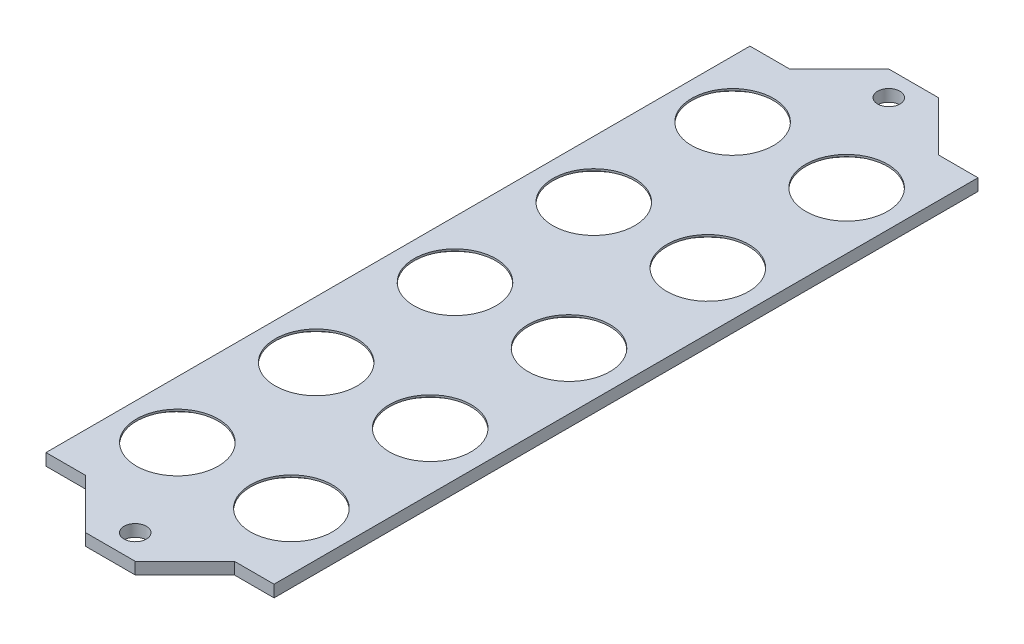
ISO-10303-21;
HEADER;
FILE_DESCRIPTION(('STEP AP214'),'2;1');
FILE_NAME('part.step','',(''),(''),'','','');
FILE_SCHEMA(('AUTOMOTIVE_DESIGN { 1 0 10303 214 1 1 1 1 }'));
ENDSEC;
DATA;
#1=APPLICATION_CONTEXT('core data for automotive mechanical design processes');
#2=APPLICATION_PROTOCOL_DEFINITION('international standard','automotive_design',2000,#1);
#3=PRODUCT_CONTEXT('',#1,'mechanical');
#4=PRODUCT('Part','Part','',(#3));
#5=PRODUCT_RELATED_PRODUCT_CATEGORY('part','',(#4));
#6=PRODUCT_DEFINITION_FORMATION('','',#4);
#7=PRODUCT_DEFINITION_CONTEXT('part definition',#1,'design');
#8=PRODUCT_DEFINITION('design','',#6,#7);
#9=PRODUCT_DEFINITION_SHAPE('','',#8);
#10=(LENGTH_UNIT() NAMED_UNIT(*) SI_UNIT(.MILLI.,.METRE.));
#11=(NAMED_UNIT(*) PLANE_ANGLE_UNIT() SI_UNIT($,.RADIAN.));
#12=(NAMED_UNIT(*) SI_UNIT($,.STERADIAN.) SOLID_ANGLE_UNIT());
#13=UNCERTAINTY_MEASURE_WITH_UNIT(LENGTH_MEASURE(1.E-05),#10,'distance_accuracy_value','');
#14=(GEOMETRIC_REPRESENTATION_CONTEXT(3) GLOBAL_UNCERTAINTY_ASSIGNED_CONTEXT((#13)) GLOBAL_UNIT_ASSIGNED_CONTEXT((#10,
#11,#12)) REPRESENTATION_CONTEXT('',''));
#15=CARTESIAN_POINT('',(0.,0.,0.));
#16=DIRECTION('',(0.,0.,1.));
#17=DIRECTION('',(1.,0.,0.));
#18=AXIS2_PLACEMENT_3D('',#15,#16,#17);
#19=CARTESIAN_POINT('',(0.,0.4,0.));
#20=DIRECTION('',(0.,1.,0.));
#21=DIRECTION('',(0.,0.,1.));
#22=AXIS2_PLACEMENT_3D('',#19,#20,#21);
#23=PLANE('',#22);
#24=CARTESIAN_POINT('',(11.5,0.4,132.));
#25=DIRECTION('',(0.,1.,0.));
#26=DIRECTION('',(0.,0.,1.));
#27=AXIS2_PLACEMENT_3D('',#24,#25,#26);
#28=CIRCLE('',#27,2.25);
#29=CARTESIAN_POINT('',(11.5,0.4,134.25));
#30=VERTEX_POINT('',#29);
#31=EDGE_CURVE('E752',#30,#30,#28,.F.);
#32=ORIENTED_EDGE('',*,*,#31,.T.);
#33=EDGE_LOOP('',(#32));
#34=FACE_BOUND('',#33,.T.);
#35=DIRECTION('',(0.70710678118656,0.,0.707106781186535));
#36=VECTOR('',#35,1.);
#37=CARTESIAN_POINT('',(20.7499999999997,0.4,-20.7500000000004));
#38=LINE('',#37,#36);
#39=CARTESIAN_POINT('',(16.5,0.4,-25.));
#40=VERTEX_POINT('',#39);
#41=CARTESIAN_POINT('',(26.5000000000003,0.4,-15.));
#42=VERTEX_POINT('',#41);
#43=EDGE_CURVE('E533',#40,#42,#38,.T.);
#44=ORIENTED_EDGE('',*,*,#43,.F.);
#45=DIRECTION('',(1.,0.,0.));
#46=VECTOR('',#45,1.);
#47=CARTESIAN_POINT('',(4.68375338513744E-13,0.4,-25.0000000000003));
#48=LINE('',#47,#46);
#49=CARTESIAN_POINT('',(6.5,0.4,-25.0000000000002));
#50=VERTEX_POINT('',#49);
#51=EDGE_CURVE('E600',#50,#40,#48,.T.);
#52=ORIENTED_EDGE('',*,*,#51,.F.);
#53=DIRECTION('',(-0.707106781186544,0.,0.707106781186551));
#54=VECTOR('',#53,1.);
#55=CARTESIAN_POINT('',(-9.25000000000006,0.4,-9.24999999999996));
#56=LINE('',#55,#54);
#57=CARTESIAN_POINT('',(-3.5,0.4,-15.));
#58=VERTEX_POINT('',#57);
#59=EDGE_CURVE('E605',#50,#58,#56,.T.);
#60=ORIENTED_EDGE('',*,*,#59,.T.);
#61=DIRECTION('',(1.,0.,0.));
#62=VECTOR('',#61,1.);
#63=CARTESIAN_POINT('',(0.,0.4,-15.));
#64=LINE('',#63,#62);
#65=CARTESIAN_POINT('',(-11.5,0.4,-15.));
#66=VERTEX_POINT('',#65);
#67=EDGE_CURVE('E608',#66,#58,#64,.T.);
#68=ORIENTED_EDGE('',*,*,#67,.F.);
#69=DIRECTION('',(0.,0.,1.));
#70=VECTOR('',#69,1.);
#71=CARTESIAN_POINT('',(-11.5,0.4,0.));
#72=LINE('',#71,#70);
#73=CARTESIAN_POINT('',(-11.5,0.4,127.));
#74=VERTEX_POINT('',#73);
#75=EDGE_CURVE('E612',#66,#74,#72,.T.);
#76=ORIENTED_EDGE('',*,*,#75,.T.);
#77=DIRECTION('',(1.,0.,0.));
#78=VECTOR('',#77,1.);
#79=CARTESIAN_POINT('',(0.,0.4,127.));
#80=LINE('',#79,#78);
#81=CARTESIAN_POINT('',(-3.50000000000012,0.4,127.));
#82=VERTEX_POINT('',#81);
#83=EDGE_CURVE('E616',#74,#82,#80,.T.);
#84=ORIENTED_EDGE('',*,*,#83,.T.);
#85=DIRECTION('',(-0.707106781186548,0.,-0.707106781186547));
#86=VECTOR('',#85,1.);
#87=CARTESIAN_POINT('',(-65.2500000000001,0.4,65.2500000000002));
#88=LINE('',#87,#86);
#89=CARTESIAN_POINT('',(6.49999999999995,0.4,137.));
#90=VERTEX_POINT('',#89);
#91=EDGE_CURVE('E619',#90,#82,#88,.T.);
#92=ORIENTED_EDGE('',*,*,#91,.F.);
#93=DIRECTION('',(1.,0.,0.));
#94=VECTOR('',#93,1.);
#95=CARTESIAN_POINT('',(-3.80251385934116E-13,0.4,137.));
#96=LINE('',#95,#94);
#97=CARTESIAN_POINT('',(16.4999999999999,0.4,137.));
#98=VERTEX_POINT('',#97);
#99=EDGE_CURVE('E624',#90,#98,#96,.T.);
#100=ORIENTED_EDGE('',*,*,#99,.T.);
#101=DIRECTION('',(0.707106781186546,0.,-0.707106781186549));
#102=VECTOR('',#101,1.);
#103=CARTESIAN_POINT('',(76.75,0.4,76.7499999999997));
#104=LINE('',#103,#102);
#105=CARTESIAN_POINT('',(26.4999999999999,0.4,127.));
#106=VERTEX_POINT('',#105);
#107=EDGE_CURVE('E627',#98,#106,#104,.T.);
#108=ORIENTED_EDGE('',*,*,#107,.T.);
#109=CARTESIAN_POINT('',(34.5,0.4,127.));
#110=VERTEX_POINT('',#109);
#111=EDGE_CURVE('E620',#106,#110,#80,.T.);
#112=ORIENTED_EDGE('',*,*,#111,.T.);
#113=DIRECTION('',(0.,0.,1.));
#114=VECTOR('',#113,1.);
#115=CARTESIAN_POINT('',(34.5,0.4,0.));
#116=LINE('',#115,#114);
#117=CARTESIAN_POINT('',(34.5,0.4,-15.));
#118=VERTEX_POINT('',#117);
#119=EDGE_CURVE('E630',#118,#110,#116,.T.);
#120=ORIENTED_EDGE('',*,*,#119,.F.);
#121=EDGE_CURVE('E613',#42,#118,#64,.T.);
#122=ORIENTED_EDGE('',*,*,#121,.F.);
#123=EDGE_LOOP('',(#44,#52,#60,#68,#76,#84,#92,#100,#108,#112,#120,#122));
#124=FACE_BOUND('',#123,.T.);
#125=CARTESIAN_POINT('',(0.,0.4,0.));
#126=DIRECTION('',(0.,1.,0.));
#127=DIRECTION('',(0.,0.,1.));
#128=AXIS2_PLACEMENT_3D('',#125,#126,#127);
#129=CIRCLE('',#128,8.25);
#130=CARTESIAN_POINT('',(0.,0.4,8.25));
#131=VERTEX_POINT('',#130);
#132=EDGE_CURVE('E633',#131,#131,#129,.T.);
#133=ORIENTED_EDGE('',*,*,#132,.F.);
#134=EDGE_LOOP('',(#133));
#135=FACE_BOUND('',#134,.T.);
#136=CARTESIAN_POINT('',(23.,0.4,0.));
#137=DIRECTION('',(0.,1.,0.));
#138=DIRECTION('',(0.,0.,1.));
#139=AXIS2_PLACEMENT_3D('',#136,#137,#138);
#140=CIRCLE('',#139,8.25000000000001);
#141=CARTESIAN_POINT('',(23.,0.4,8.25000000000001));
#142=VERTEX_POINT('',#141);
#143=EDGE_CURVE('E637',#142,#142,#140,.T.);
#144=ORIENTED_EDGE('',*,*,#143,.F.);
#145=EDGE_LOOP('',(#144));
#146=FACE_BOUND('',#145,.T.);
#147=CARTESIAN_POINT('',(23.0000000000003,0.4,28.));
#148=DIRECTION('',(0.,1.,0.));
#149=DIRECTION('',(0.,0.,1.));
#150=AXIS2_PLACEMENT_3D('',#147,#148,#149);
#151=CIRCLE('',#150,8.25000000000001);
#152=CARTESIAN_POINT('',(23.0000000000003,0.4,36.25));
#153=VERTEX_POINT('',#152);
#154=EDGE_CURVE('E641',#153,#153,#151,.T.);
#155=ORIENTED_EDGE('',*,*,#154,.F.);
#156=EDGE_LOOP('',(#155));
#157=FACE_BOUND('',#156,.T.);
#158=CARTESIAN_POINT('',(2.91569926944017E-13,0.4,28.));
#159=DIRECTION('',(0.,1.,0.));
#160=DIRECTION('',(0.,0.,1.));
#161=AXIS2_PLACEMENT_3D('',#158,#159,#160);
#162=CIRCLE('',#161,8.25);
#163=CARTESIAN_POINT('',(2.91569926944017E-13,0.4,36.25));
#164=VERTEX_POINT('',#163);
#165=EDGE_CURVE('E645',#164,#164,#162,.T.);
#166=ORIENTED_EDGE('',*,*,#165,.F.);
#167=EDGE_LOOP('',(#166));
#168=FACE_BOUND('',#167,.T.);
#169=CARTESIAN_POINT('',(5.83139853888034E-13,0.4,56.));
#170=DIRECTION('',(0.,1.,0.));
#171=DIRECTION('',(0.,0.,1.));
#172=AXIS2_PLACEMENT_3D('',#169,#170,#171);
#173=CIRCLE('',#172,8.25);
#174=CARTESIAN_POINT('',(5.83139853888034E-13,0.4,64.25));
#175=VERTEX_POINT('',#174);
#176=EDGE_CURVE('E649',#175,#175,#173,.T.);
#177=ORIENTED_EDGE('',*,*,#176,.F.);
#178=EDGE_LOOP('',(#177));
#179=FACE_BOUND('',#178,.T.);
#180=CARTESIAN_POINT('',(23.0000000000006,0.4,56.));
#181=DIRECTION('',(0.,1.,0.));
#182=DIRECTION('',(0.,0.,1.));
#183=AXIS2_PLACEMENT_3D('',#180,#181,#182);
#184=CIRCLE('',#183,8.25000000000001);
#185=CARTESIAN_POINT('',(23.0000000000006,0.4,64.25));
#186=VERTEX_POINT('',#185);
#187=EDGE_CURVE('E653',#186,#186,#184,.T.);
#188=ORIENTED_EDGE('',*,*,#187,.F.);
#189=EDGE_LOOP('',(#188));
#190=FACE_BOUND('',#189,.T.);
#191=CARTESIAN_POINT('',(8.74709780832051E-13,0.4,84.));
#192=DIRECTION('',(0.,1.,0.));
#193=DIRECTION('',(0.,0.,1.));
#194=AXIS2_PLACEMENT_3D('',#191,#192,#193);
#195=CIRCLE('',#194,8.25);
#196=CARTESIAN_POINT('',(8.74709780832051E-13,0.4,92.25));
#197=VERTEX_POINT('',#196);
#198=EDGE_CURVE('E657',#197,#197,#195,.T.);
#199=ORIENTED_EDGE('',*,*,#198,.F.);
#200=EDGE_LOOP('',(#199));
#201=FACE_BOUND('',#200,.T.);
#202=CARTESIAN_POINT('',(23.0000000000009,0.4,84.));
#203=DIRECTION('',(0.,1.,0.));
#204=DIRECTION('',(0.,0.,1.));
#205=AXIS2_PLACEMENT_3D('',#202,#203,#204);
#206=CIRCLE('',#205,8.25000000000001);
#207=CARTESIAN_POINT('',(23.0000000000009,0.4,92.25));
#208=VERTEX_POINT('',#207);
#209=EDGE_CURVE('E661',#208,#208,#206,.T.);
#210=ORIENTED_EDGE('',*,*,#209,.F.);
#211=EDGE_LOOP('',(#210));
#212=FACE_BOUND('',#211,.T.);
#213=CARTESIAN_POINT('',(1.16627970777607E-12,0.4,112.));
#214=DIRECTION('',(0.,1.,0.));
#215=DIRECTION('',(0.,0.,1.));
#216=AXIS2_PLACEMENT_3D('',#213,#214,#215);
#217=CIRCLE('',#216,8.25);
#218=CARTESIAN_POINT('',(1.16627970777607E-12,0.4,120.25));
#219=VERTEX_POINT('',#218);
#220=EDGE_CURVE('E665',#219,#219,#217,.T.);
#221=ORIENTED_EDGE('',*,*,#220,.F.);
#222=EDGE_LOOP('',(#221));
#223=FACE_BOUND('',#222,.T.);
#224=CARTESIAN_POINT('',(23.0000000000012,0.4,112.));
#225=DIRECTION('',(0.,1.,0.));
#226=DIRECTION('',(0.,0.,1.));
#227=AXIS2_PLACEMENT_3D('',#224,#225,#226);
#228=CIRCLE('',#227,8.25000000000001);
#229=CARTESIAN_POINT('',(23.0000000000012,0.4,120.25));
#230=VERTEX_POINT('',#229);
#231=EDGE_CURVE('E536',#230,#230,#228,.T.);
#232=ORIENTED_EDGE('',*,*,#231,.F.);
#233=EDGE_LOOP('',(#232));
#234=FACE_BOUND('',#233,.T.);
#235=CARTESIAN_POINT('',(11.5,0.4,-20.));
#236=DIRECTION('',(0.,1.,0.));
#237=DIRECTION('',(0.,0.,1.));
#238=AXIS2_PLACEMENT_3D('',#235,#236,#237);
#239=CIRCLE('',#238,2.25);
#240=CARTESIAN_POINT('',(11.5,0.4,-17.75));
#241=VERTEX_POINT('',#240);
#242=EDGE_CURVE('E744',#241,#241,#239,.T.);
#243=ORIENTED_EDGE('',*,*,#242,.F.);
#244=EDGE_LOOP('',(#243));
#245=FACE_BOUND('',#244,.T.);
#246=ADVANCED_FACE('F437',(#34,#124,#135,#146,#157,#168,#179,#190,#201,#212,#223,#234,#245),#23,.T.);
#247=CARTESIAN_POINT('',(0.,-2.,0.));
#248=DIRECTION('',(0.,-1.,0.));
#249=DIRECTION('',(0.,0.,-1.));
#250=AXIS2_PLACEMENT_3D('',#247,#248,#249);
#251=PLANE('',#250);
#252=CARTESIAN_POINT('',(11.5,-2.,132.));
#253=DIRECTION('',(0.,-1.,0.));
#254=DIRECTION('',(0.,0.,-1.));
#255=AXIS2_PLACEMENT_3D('',#252,#253,#254);
#256=CIRCLE('',#255,2.25);
#257=CARTESIAN_POINT('',(11.5,-2.,129.75));
#258=VERTEX_POINT('',#257);
#259=EDGE_CURVE('E741',#258,#258,#256,.F.);
#260=ORIENTED_EDGE('',*,*,#259,.T.);
#261=EDGE_LOOP('',(#260));
#262=FACE_BOUND('',#261,.T.);
#263=CARTESIAN_POINT('',(0.,-2.,0.));
#264=DIRECTION('',(0.,1.,0.));
#265=DIRECTION('',(0.,0.,1.));
#266=AXIS2_PLACEMENT_3D('',#263,#264,#265);
#267=CIRCLE('',#266,11.);
#268=CARTESIAN_POINT('',(0.,-2.,11.));
#269=VERTEX_POINT('',#268);
#270=EDGE_CURVE('E750',#269,#269,#267,.T.);
#271=ORIENTED_EDGE('',*,*,#270,.T.);
#272=EDGE_LOOP('',(#271));
#273=FACE_BOUND('',#272,.T.);
#274=CARTESIAN_POINT('',(23.0000000000012,-2.,112.));
#275=DIRECTION('',(0.,1.,0.));
#276=DIRECTION('',(0.,0.,1.));
#277=AXIS2_PLACEMENT_3D('',#274,#275,#276);
#278=CIRCLE('',#277,11.);
#279=CARTESIAN_POINT('',(23.0000000000012,-2.,123.));
#280=VERTEX_POINT('',#279);
#281=EDGE_CURVE('E762',#280,#280,#278,.T.);
#282=ORIENTED_EDGE('',*,*,#281,.T.);
#283=EDGE_LOOP('',(#282));
#284=FACE_BOUND('',#283,.T.);
#285=CARTESIAN_POINT('',(1.16627970777607E-12,-2.,112.));
#286=DIRECTION('',(0.,1.,0.));
#287=DIRECTION('',(0.,0.,1.));
#288=AXIS2_PLACEMENT_3D('',#285,#286,#287);
#289=CIRCLE('',#288,11.);
#290=CARTESIAN_POINT('',(1.16627970777607E-12,-2.,123.));
#291=VERTEX_POINT('',#290);
#292=EDGE_CURVE('E767',#291,#291,#289,.T.);
#293=ORIENTED_EDGE('',*,*,#292,.T.);
#294=EDGE_LOOP('',(#293));
#295=FACE_BOUND('',#294,.T.);
#296=CARTESIAN_POINT('',(23.0000000000009,-2.,84.));
#297=DIRECTION('',(0.,1.,0.));
#298=DIRECTION('',(0.,0.,1.));
#299=AXIS2_PLACEMENT_3D('',#296,#297,#298);
#300=CIRCLE('',#299,11.);
#301=CARTESIAN_POINT('',(23.0000000000009,-2.,95.));
#302=VERTEX_POINT('',#301);
#303=EDGE_CURVE('E775',#302,#302,#300,.T.);
#304=ORIENTED_EDGE('',*,*,#303,.T.);
#305=EDGE_LOOP('',(#304));
#306=FACE_BOUND('',#305,.T.);
#307=CARTESIAN_POINT('',(8.74709780832051E-13,-2.,84.));
#308=DIRECTION('',(0.,1.,0.));
#309=DIRECTION('',(0.,0.,1.));
#310=AXIS2_PLACEMENT_3D('',#307,#308,#309);
#311=CIRCLE('',#310,11.);
#312=CARTESIAN_POINT('',(8.74709780832051E-13,-2.,95.));
#313=VERTEX_POINT('',#312);
#314=EDGE_CURVE('E783',#313,#313,#311,.T.);
#315=ORIENTED_EDGE('',*,*,#314,.T.);
#316=EDGE_LOOP('',(#315));
#317=FACE_BOUND('',#316,.T.);
#318=CARTESIAN_POINT('',(23.0000000000006,-2.,56.));
#319=DIRECTION('',(0.,1.,0.));
#320=DIRECTION('',(0.,0.,1.));
#321=AXIS2_PLACEMENT_3D('',#318,#319,#320);
#322=CIRCLE('',#321,11.);
#323=CARTESIAN_POINT('',(23.0000000000006,-2.,67.));
#324=VERTEX_POINT('',#323);
#325=EDGE_CURVE('E791',#324,#324,#322,.T.);
#326=ORIENTED_EDGE('',*,*,#325,.T.);
#327=EDGE_LOOP('',(#326));
#328=FACE_BOUND('',#327,.T.);
#329=CARTESIAN_POINT('',(5.83139853888034E-13,-2.,56.));
#330=DIRECTION('',(0.,1.,0.));
#331=DIRECTION('',(0.,0.,1.));
#332=AXIS2_PLACEMENT_3D('',#329,#330,#331);
#333=CIRCLE('',#332,11.);
#334=CARTESIAN_POINT('',(5.83139853888034E-13,-2.,67.));
#335=VERTEX_POINT('',#334);
#336=EDGE_CURVE('E799',#335,#335,#333,.T.);
#337=ORIENTED_EDGE('',*,*,#336,.T.);
#338=EDGE_LOOP('',(#337));
#339=FACE_BOUND('',#338,.T.);
#340=CARTESIAN_POINT('',(2.91569926944017E-13,-2.,28.));
#341=DIRECTION('',(0.,1.,0.));
#342=DIRECTION('',(0.,0.,1.));
#343=AXIS2_PLACEMENT_3D('',#340,#341,#342);
#344=CIRCLE('',#343,11.);
#345=CARTESIAN_POINT('',(2.91569926944017E-13,-2.,39.));
#346=VERTEX_POINT('',#345);
#347=EDGE_CURVE('E807',#346,#346,#344,.T.);
#348=ORIENTED_EDGE('',*,*,#347,.T.);
#349=EDGE_LOOP('',(#348));
#350=FACE_BOUND('',#349,.T.);
#351=CARTESIAN_POINT('',(23.0000000000003,-2.,28.));
#352=DIRECTION('',(0.,1.,0.));
#353=DIRECTION('',(0.,0.,1.));
#354=AXIS2_PLACEMENT_3D('',#351,#352,#353);
#355=CIRCLE('',#354,11.);
#356=CARTESIAN_POINT('',(23.0000000000003,-2.,39.));
#357=VERTEX_POINT('',#356);
#358=EDGE_CURVE('E556',#357,#357,#355,.T.);
#359=ORIENTED_EDGE('',*,*,#358,.T.);
#360=EDGE_LOOP('',(#359));
#361=FACE_BOUND('',#360,.T.);
#362=CARTESIAN_POINT('',(23.,-2.,0.));
#363=DIRECTION('',(0.,1.,0.));
#364=DIRECTION('',(0.,0.,1.));
#365=AXIS2_PLACEMENT_3D('',#362,#363,#364);
#366=CIRCLE('',#365,11.);
#367=CARTESIAN_POINT('',(23.,-2.,11.));
#368=VERTEX_POINT('',#367);
#369=EDGE_CURVE('E552',#368,#368,#366,.T.);
#370=ORIENTED_EDGE('',*,*,#369,.T.);
#371=EDGE_LOOP('',(#370));
#372=FACE_BOUND('',#371,.T.);
#373=DIRECTION('',(-1.,0.,0.));
#374=VECTOR('',#373,1.);
#375=CARTESIAN_POINT('',(0.,-2.,-15.));
#376=LINE('',#375,#374);
#377=CARTESIAN_POINT('',(34.5,-2.,-15.));
#378=VERTEX_POINT('',#377);
#379=CARTESIAN_POINT('',(26.5000000000003,-2.,-15.));
#380=VERTEX_POINT('',#379);
#381=EDGE_CURVE('E544',#378,#380,#376,.T.);
#382=ORIENTED_EDGE('',*,*,#381,.F.);
#383=DIRECTION('',(0.,0.,-1.));
#384=VECTOR('',#383,1.);
#385=CARTESIAN_POINT('',(34.5,-2.,0.));
#386=LINE('',#385,#384);
#387=CARTESIAN_POINT('',(34.5,-2.,127.));
#388=VERTEX_POINT('',#387);
#389=EDGE_CURVE('E594',#388,#378,#386,.T.);
#390=ORIENTED_EDGE('',*,*,#389,.F.);
#391=DIRECTION('',(-1.,0.,0.));
#392=VECTOR('',#391,1.);
#393=CARTESIAN_POINT('',(0.,-2.,127.));
#394=LINE('',#393,#392);
#395=CARTESIAN_POINT('',(26.4999999999999,-2.,127.));
#396=VERTEX_POINT('',#395);
#397=EDGE_CURVE('E590',#388,#396,#394,.T.);
#398=ORIENTED_EDGE('',*,*,#397,.T.);
#399=DIRECTION('',(-0.707106781186546,0.,0.707106781186549));
#400=VECTOR('',#399,1.);
#401=CARTESIAN_POINT('',(76.75,-2.,76.7499999999997));
#402=LINE('',#401,#400);
#403=CARTESIAN_POINT('',(16.4999999999999,-2.,137.));
#404=VERTEX_POINT('',#403);
#405=EDGE_CURVE('E586',#396,#404,#402,.T.);
#406=ORIENTED_EDGE('',*,*,#405,.T.);
#407=DIRECTION('',(-1.,0.,0.));
#408=VECTOR('',#407,1.);
#409=CARTESIAN_POINT('',(-3.80251385934116E-13,-2.,137.));
#410=LINE('',#409,#408);
#411=CARTESIAN_POINT('',(6.49999999999998,-2.,137.));
#412=VERTEX_POINT('',#411);
#413=EDGE_CURVE('E582',#404,#412,#410,.T.);
#414=ORIENTED_EDGE('',*,*,#413,.T.);
#415=DIRECTION('',(0.707106781186548,0.,0.707106781186547));
#416=VECTOR('',#415,1.);
#417=CARTESIAN_POINT('',(-65.25,-2.,65.2500000000002));
#418=LINE('',#417,#416);
#419=CARTESIAN_POINT('',(-3.50000000000008,-2.,127.));
#420=VERTEX_POINT('',#419);
#421=EDGE_CURVE('E578',#420,#412,#418,.T.);
#422=ORIENTED_EDGE('',*,*,#421,.F.);
#423=DIRECTION('',(-1.,0.,0.));
#424=VECTOR('',#423,1.);
#425=CARTESIAN_POINT('',(0.,-2.,127.));
#426=LINE('',#425,#424);
#427=CARTESIAN_POINT('',(-11.5,-2.,127.));
#428=VERTEX_POINT('',#427);
#429=EDGE_CURVE('E574',#420,#428,#426,.T.);
#430=ORIENTED_EDGE('',*,*,#429,.T.);
#431=DIRECTION('',(0.,0.,-1.));
#432=VECTOR('',#431,1.);
#433=CARTESIAN_POINT('',(-11.5,-2.,0.));
#434=LINE('',#433,#432);
#435=CARTESIAN_POINT('',(-11.5,-2.,-15.));
#436=VERTEX_POINT('',#435);
#437=EDGE_CURVE('E570',#428,#436,#434,.T.);
#438=ORIENTED_EDGE('',*,*,#437,.T.);
#439=DIRECTION('',(-1.,0.,0.));
#440=VECTOR('',#439,1.);
#441=CARTESIAN_POINT('',(0.,-2.,-15.));
#442=LINE('',#441,#440);
#443=CARTESIAN_POINT('',(-3.50000000000004,-2.,-15.));
#444=VERTEX_POINT('',#443);
#445=EDGE_CURVE('E566',#444,#436,#442,.T.);
#446=ORIENTED_EDGE('',*,*,#445,.F.);
#447=DIRECTION('',(0.707106781186544,0.,-0.707106781186551));
#448=VECTOR('',#447,1.);
#449=CARTESIAN_POINT('',(-9.25000000000006,-2.,-9.24999999999996));
#450=LINE('',#449,#448);
#451=CARTESIAN_POINT('',(6.5,-2.,-25.0000000000002));
#452=VERTEX_POINT('',#451);
#453=EDGE_CURVE('E563',#444,#452,#450,.T.);
#454=ORIENTED_EDGE('',*,*,#453,.T.);
#455=DIRECTION('',(-1.,0.,0.));
#456=VECTOR('',#455,1.);
#457=CARTESIAN_POINT('',(4.68375338513744E-13,-2.,-25.0000000000003));
#458=LINE('',#457,#456);
#459=CARTESIAN_POINT('',(16.5,-2.,-25.));
#460=VERTEX_POINT('',#459);
#461=EDGE_CURVE('E547',#460,#452,#458,.T.);
#462=ORIENTED_EDGE('',*,*,#461,.F.);
#463=DIRECTION('',(-0.70710678118656,0.,-0.707106781186535));
#464=VECTOR('',#463,1.);
#465=CARTESIAN_POINT('',(20.7499999999997,-2.,-20.7500000000004));
#466=LINE('',#465,#464);
#467=EDGE_CURVE('E531',#380,#460,#466,.T.);
#468=ORIENTED_EDGE('',*,*,#467,.F.);
#469=EDGE_LOOP('',(#382,#390,#398,#406,#414,#422,#430,#438,#446,#454,#462,#468));
#470=FACE_BOUND('',#469,.T.);
#471=CARTESIAN_POINT('',(11.5,-2.,-20.));
#472=DIRECTION('',(0.,-1.,0.));
#473=DIRECTION('',(0.,0.,-1.));
#474=AXIS2_PLACEMENT_3D('',#471,#472,#473);
#475=CIRCLE('',#474,2.25);
#476=CARTESIAN_POINT('',(11.5,-2.,-22.25));
#477=VERTEX_POINT('',#476);
#478=EDGE_CURVE('E441',#477,#477,#475,.T.);
#479=ORIENTED_EDGE('',*,*,#478,.F.);
#480=EDGE_LOOP('',(#479));
#481=FACE_BOUND('',#480,.T.);
#482=ADVANCED_FACE('F541',(#262,#273,#284,#295,#306,#317,#328,#339,#350,#361,#372,#470,#481),
#251,.T.);
#483=CARTESIAN_POINT('',(0.,0.,0.));
#484=DIRECTION('',(0.,1.,0.));
#485=DIRECTION('',(0.,0.,1.));
#486=AXIS2_PLACEMENT_3D('',#483,#484,#485);
#487=PLANE('',#486);
#488=CARTESIAN_POINT('',(0.,0.,0.));
#489=DIRECTION('',(0.,1.,0.));
#490=DIRECTION('',(0.,0.,1.));
#491=AXIS2_PLACEMENT_3D('',#488,#489,#490);
#492=CIRCLE('',#491,8.25);
#493=CARTESIAN_POINT('',(0.,0.,8.25));
#494=VERTEX_POINT('',#493);
#495=EDGE_CURVE('E597',#494,#494,#492,.T.);
#496=ORIENTED_EDGE('',*,*,#495,.T.);
#497=EDGE_LOOP('',(#496));
#498=FACE_BOUND('',#497,.T.);
#499=CARTESIAN_POINT('',(0.,0.,0.));
#500=DIRECTION('',(0.,1.,0.));
#501=DIRECTION('',(0.,0.,1.));
#502=AXIS2_PLACEMENT_3D('',#499,#500,#501);
#503=CIRCLE('',#502,11.);
#504=CARTESIAN_POINT('',(0.,0.,11.));
#505=VERTEX_POINT('',#504);
#506=EDGE_CURVE('E12',#505,#505,#503,.T.);
#507=ORIENTED_EDGE('',*,*,#506,.F.);
#508=EDGE_LOOP('',(#507));
#509=FACE_BOUND('',#508,.T.);
#510=ADVANCED_FACE('F837',(#498,#509),#487,.F.);
#511=CARTESIAN_POINT('',(23.0000000000012,0.,112.));
#512=DIRECTION('',(0.,1.,0.));
#513=DIRECTION('',(0.,0.,1.));
#514=AXIS2_PLACEMENT_3D('',#511,#512,#513);
#515=CIRCLE('',#514,8.25000000000001);
#516=CARTESIAN_POINT('',(23.0000000000012,0.,120.25));
#517=VERTEX_POINT('',#516);
#518=EDGE_CURVE('E601',#517,#517,#515,.T.);
#519=ORIENTED_EDGE('',*,*,#518,.T.);
#520=EDGE_LOOP('',(#519));
#521=FACE_BOUND('',#520,.T.);
#522=CARTESIAN_POINT('',(23.0000000000012,0.,112.));
#523=DIRECTION('',(0.,1.,0.));
#524=DIRECTION('',(0.,0.,1.));
#525=AXIS2_PLACEMENT_3D('',#522,#523,#524);
#526=CIRCLE('',#525,11.);
#527=CARTESIAN_POINT('',(23.0000000000012,0.,123.));
#528=VERTEX_POINT('',#527);
#529=EDGE_CURVE('E447',#528,#528,#526,.T.);
#530=ORIENTED_EDGE('',*,*,#529,.F.);
#531=EDGE_LOOP('',(#530));
#532=FACE_BOUND('',#531,.T.);
#533=ADVANCED_FACE('F848',(#521,#532),#487,.F.);
#534=CARTESIAN_POINT('',(1.16627970777607E-12,0.,112.));
#535=DIRECTION('',(0.,1.,0.));
#536=DIRECTION('',(0.,0.,1.));
#537=AXIS2_PLACEMENT_3D('',#534,#535,#536);
#538=CIRCLE('',#537,8.25);
#539=CARTESIAN_POINT('',(1.16627970777607E-12,0.,120.25));
#540=VERTEX_POINT('',#539);
#541=EDGE_CURVE('E703',#540,#540,#538,.T.);
#542=ORIENTED_EDGE('',*,*,#541,.T.);
#543=EDGE_LOOP('',(#542));
#544=FACE_BOUND('',#543,.T.);
#545=CARTESIAN_POINT('',(1.16627970777607E-12,0.,112.));
#546=DIRECTION('',(0.,1.,0.));
#547=DIRECTION('',(0.,0.,1.));
#548=AXIS2_PLACEMENT_3D('',#545,#546,#547);
#549=CIRCLE('',#548,11.);
#550=CARTESIAN_POINT('',(1.16627970777607E-12,0.,123.));
#551=VERTEX_POINT('',#550);
#552=EDGE_CURVE('E771',#551,#551,#549,.T.);
#553=ORIENTED_EDGE('',*,*,#552,.F.);
#554=EDGE_LOOP('',(#553));
#555=FACE_BOUND('',#554,.T.);
#556=ADVANCED_FACE('F1061',(#544,#555),#487,.F.);
#557=CARTESIAN_POINT('',(23.0000000000009,0.,84.));
#558=DIRECTION('',(0.,1.,0.));
#559=DIRECTION('',(0.,0.,1.));
#560=AXIS2_PLACEMENT_3D('',#557,#558,#559);
#561=CIRCLE('',#560,8.25000000000001);
#562=CARTESIAN_POINT('',(23.0000000000009,0.,92.25));
#563=VERTEX_POINT('',#562);
#564=EDGE_CURVE('E699',#563,#563,#561,.T.);
#565=ORIENTED_EDGE('',*,*,#564,.T.);
#566=EDGE_LOOP('',(#565));
#567=FACE_BOUND('',#566,.T.);
#568=CARTESIAN_POINT('',(23.0000000000009,0.,84.));
#569=DIRECTION('',(0.,1.,0.));
#570=DIRECTION('',(0.,0.,1.));
#571=AXIS2_PLACEMENT_3D('',#568,#569,#570);
#572=CIRCLE('',#571,11.);
#573=CARTESIAN_POINT('',(23.0000000000009,0.,95.));
#574=VERTEX_POINT('',#573);
#575=EDGE_CURVE('E779',#574,#574,#572,.T.);
#576=ORIENTED_EDGE('',*,*,#575,.F.);
#577=EDGE_LOOP('',(#576));
#578=FACE_BOUND('',#577,.T.);
#579=ADVANCED_FACE('F1072',(#567,#578),#487,.F.);
#580=CARTESIAN_POINT('',(8.74709780832051E-13,0.,84.));
#581=DIRECTION('',(0.,1.,0.));
#582=DIRECTION('',(0.,0.,1.));
#583=AXIS2_PLACEMENT_3D('',#580,#581,#582);
#584=CIRCLE('',#583,8.25);
#585=CARTESIAN_POINT('',(8.74709780832051E-13,0.,92.25));
#586=VERTEX_POINT('',#585);
#587=EDGE_CURVE('E695',#586,#586,#584,.T.);
#588=ORIENTED_EDGE('',*,*,#587,.T.);
#589=EDGE_LOOP('',(#588));
#590=FACE_BOUND('',#589,.T.);
#591=CARTESIAN_POINT('',(8.74709780832051E-13,0.,84.));
#592=DIRECTION('',(0.,1.,0.));
#593=DIRECTION('',(0.,0.,1.));
#594=AXIS2_PLACEMENT_3D('',#591,#592,#593);
#595=CIRCLE('',#594,11.);
#596=CARTESIAN_POINT('',(8.74709780832051E-13,0.,95.));
#597=VERTEX_POINT('',#596);
#598=EDGE_CURVE('E787',#597,#597,#595,.T.);
#599=ORIENTED_EDGE('',*,*,#598,.F.);
#600=EDGE_LOOP('',(#599));
#601=FACE_BOUND('',#600,.T.);
#602=ADVANCED_FACE('F1083',(#590,#601),#487,.F.);
#603=CARTESIAN_POINT('',(23.0000000000006,0.,56.));
#604=DIRECTION('',(0.,1.,0.));
#605=DIRECTION('',(0.,0.,1.));
#606=AXIS2_PLACEMENT_3D('',#603,#604,#605);
#607=CIRCLE('',#606,8.25000000000001);
#608=CARTESIAN_POINT('',(23.0000000000006,0.,64.25));
#609=VERTEX_POINT('',#608);
#610=EDGE_CURVE('E691',#609,#609,#607,.T.);
#611=ORIENTED_EDGE('',*,*,#610,.T.);
#612=EDGE_LOOP('',(#611));
#613=FACE_BOUND('',#612,.T.);
#614=CARTESIAN_POINT('',(23.0000000000006,0.,56.));
#615=DIRECTION('',(0.,1.,0.));
#616=DIRECTION('',(0.,0.,1.));
#617=AXIS2_PLACEMENT_3D('',#614,#615,#616);
#618=CIRCLE('',#617,11.);
#619=CARTESIAN_POINT('',(23.0000000000006,0.,67.));
#620=VERTEX_POINT('',#619);
#621=EDGE_CURVE('E795',#620,#620,#618,.T.);
#622=ORIENTED_EDGE('',*,*,#621,.F.);
#623=EDGE_LOOP('',(#622));
#624=FACE_BOUND('',#623,.T.);
#625=ADVANCED_FACE('F1094',(#613,#624),#487,.F.);
#626=CARTESIAN_POINT('',(5.83139853888034E-13,0.,56.));
#627=DIRECTION('',(0.,1.,0.));
#628=DIRECTION('',(0.,0.,1.));
#629=AXIS2_PLACEMENT_3D('',#626,#627,#628);
#630=CIRCLE('',#629,8.25);
#631=CARTESIAN_POINT('',(5.83139853888034E-13,0.,64.25));
#632=VERTEX_POINT('',#631);
#633=EDGE_CURVE('E687',#632,#632,#630,.T.);
#634=ORIENTED_EDGE('',*,*,#633,.T.);
#635=EDGE_LOOP('',(#634));
#636=FACE_BOUND('',#635,.T.);
#637=CARTESIAN_POINT('',(5.83139853888034E-13,0.,56.));
#638=DIRECTION('',(0.,1.,0.));
#639=DIRECTION('',(0.,0.,1.));
#640=AXIS2_PLACEMENT_3D('',#637,#638,#639);
#641=CIRCLE('',#640,11.);
#642=CARTESIAN_POINT('',(5.83139853888034E-13,0.,67.));
#643=VERTEX_POINT('',#642);
#644=EDGE_CURVE('E803',#643,#643,#641,.T.);
#645=ORIENTED_EDGE('',*,*,#644,.F.);
#646=EDGE_LOOP('',(#645));
#647=FACE_BOUND('',#646,.T.);
#648=ADVANCED_FACE('F1105',(#636,#647),#487,.F.);
#649=CARTESIAN_POINT('',(2.91569926944017E-13,0.,28.));
#650=DIRECTION('',(0.,1.,0.));
#651=DIRECTION('',(0.,0.,1.));
#652=AXIS2_PLACEMENT_3D('',#649,#650,#651);
#653=CIRCLE('',#652,8.25);
#654=CARTESIAN_POINT('',(2.91569926944017E-13,0.,36.25));
#655=VERTEX_POINT('',#654);
#656=EDGE_CURVE('E683',#655,#655,#653,.T.);
#657=ORIENTED_EDGE('',*,*,#656,.T.);
#658=EDGE_LOOP('',(#657));
#659=FACE_BOUND('',#658,.T.);
#660=CARTESIAN_POINT('',(2.91569926944017E-13,0.,28.));
#661=DIRECTION('',(0.,1.,0.));
#662=DIRECTION('',(0.,0.,1.));
#663=AXIS2_PLACEMENT_3D('',#660,#661,#662);
#664=CIRCLE('',#663,11.);
#665=CARTESIAN_POINT('',(2.91569926944017E-13,0.,39.));
#666=VERTEX_POINT('',#665);
#667=EDGE_CURVE('E811',#666,#666,#664,.T.);
#668=ORIENTED_EDGE('',*,*,#667,.F.);
#669=EDGE_LOOP('',(#668));
#670=FACE_BOUND('',#669,.T.);
#671=ADVANCED_FACE('F843',(#659,#670),#487,.F.);
#672=CARTESIAN_POINT('',(23.0000000000003,0.,28.));
#673=DIRECTION('',(0.,1.,0.));
#674=DIRECTION('',(0.,0.,1.));
#675=AXIS2_PLACEMENT_3D('',#672,#673,#674);
#676=CIRCLE('',#675,8.25000000000001);
#677=CARTESIAN_POINT('',(23.0000000000003,0.,36.25));
#678=VERTEX_POINT('',#677);
#679=EDGE_CURVE('E679',#678,#678,#676,.T.);
#680=ORIENTED_EDGE('',*,*,#679,.T.);
#681=EDGE_LOOP('',(#680));
#682=FACE_BOUND('',#681,.T.);
#683=CARTESIAN_POINT('',(23.0000000000003,0.,28.));
#684=DIRECTION('',(0.,1.,0.));
#685=DIRECTION('',(0.,0.,1.));
#686=AXIS2_PLACEMENT_3D('',#683,#684,#685);
#687=CIRCLE('',#686,11.);
#688=CARTESIAN_POINT('',(23.0000000000003,0.,39.));
#689=VERTEX_POINT('',#688);
#690=EDGE_CURVE('E818',#689,#689,#687,.T.);
#691=ORIENTED_EDGE('',*,*,#690,.F.);
#692=EDGE_LOOP('',(#691));
#693=FACE_BOUND('',#692,.T.);
#694=ADVANCED_FACE('F834',(#682,#693),#487,.F.);
#695=CARTESIAN_POINT('',(23.,0.,0.));
#696=DIRECTION('',(0.,1.,0.));
#697=DIRECTION('',(0.,0.,1.));
#698=AXIS2_PLACEMENT_3D('',#695,#696,#697);
#699=CIRCLE('',#698,8.25000000000001);
#700=CARTESIAN_POINT('',(23.,0.,8.25000000000001));
#701=VERTEX_POINT('',#700);
#702=EDGE_CURVE('E675',#701,#701,#699,.T.);
#703=ORIENTED_EDGE('',*,*,#702,.T.);
#704=EDGE_LOOP('',(#703));
#705=FACE_BOUND('',#704,.T.);
#706=CARTESIAN_POINT('',(23.,0.,0.));
#707=DIRECTION('',(0.,1.,0.));
#708=DIRECTION('',(0.,0.,1.));
#709=AXIS2_PLACEMENT_3D('',#706,#707,#708);
#710=CIRCLE('',#709,11.);
#711=CARTESIAN_POINT('',(23.,0.,11.));
#712=VERTEX_POINT('',#711);
#713=EDGE_CURVE('E559',#712,#712,#710,.T.);
#714=ORIENTED_EDGE('',*,*,#713,.F.);
#715=EDGE_LOOP('',(#714));
#716=FACE_BOUND('',#715,.T.);
#717=ADVANCED_FACE('F832',(#705,#716),#487,.F.);
#718=CARTESIAN_POINT('',(20.7499999999997,0.4,-20.7500000000004));
#719=DIRECTION('',(0.707106781186535,0.,-0.70710678118656));
#720=DIRECTION('',(-0.70710678118656,0.,-0.707106781186535));
#721=AXIS2_PLACEMENT_3D('',#718,#719,#720);
#722=PLANE('',#721);
#723=DIRECTION('',(0.,-1.,0.));
#724=VECTOR('',#723,1.);
#725=CARTESIAN_POINT('',(26.5000000000003,0.4,-15.));
#726=LINE('',#725,#724);
#727=EDGE_CURVE('E455',#42,#380,#726,.T.);
#728=ORIENTED_EDGE('',*,*,#727,.T.);
#729=ORIENTED_EDGE('',*,*,#467,.T.);
#730=DIRECTION('',(0.,-1.,0.));
#731=VECTOR('',#730,1.);
#732=CARTESIAN_POINT('',(16.5,0.4,-25.));
#733=LINE('',#732,#731);
#734=EDGE_CURVE('E739',#40,#460,#733,.T.);
#735=ORIENTED_EDGE('',*,*,#734,.F.);
#736=ORIENTED_EDGE('',*,*,#43,.T.);
#737=EDGE_LOOP('',(#728,#729,#735,#736));
#738=FACE_BOUND('',#737,.T.);
#739=ADVANCED_FACE('F439',(#738),#722,.T.);
#740=CARTESIAN_POINT('',(4.68375338513744E-13,0.4,-25.0000000000003));
#741=DIRECTION('',(0.,0.,-1.));
#742=DIRECTION('',(-1.,0.,0.));
#743=AXIS2_PLACEMENT_3D('',#740,#741,#742);
#744=PLANE('',#743);
#745=ORIENTED_EDGE('',*,*,#734,.T.);
#746=ORIENTED_EDGE('',*,*,#461,.T.);
#747=DIRECTION('',(0.,-1.,0.));
#748=VECTOR('',#747,1.);
#749=CARTESIAN_POINT('',(6.5,0.4,-25.0000000000002));
#750=LINE('',#749,#748);
#751=EDGE_CURVE('E736',#50,#452,#750,.T.);
#752=ORIENTED_EDGE('',*,*,#751,.F.);
#753=ORIENTED_EDGE('',*,*,#51,.T.);
#754=EDGE_LOOP('',(#745,#746,#752,#753));
#755=FACE_BOUND('',#754,.T.);
#756=ADVANCED_FACE('F842',(#755),#744,.T.);
#757=CARTESIAN_POINT('',(-9.25000000000006,0.4,-9.24999999999996));
#758=DIRECTION('',(0.707106781186551,0.,0.707106781186544));
#759=DIRECTION('',(0.707106781186544,0.,-0.707106781186551));
#760=AXIS2_PLACEMENT_3D('',#757,#758,#759);
#761=PLANE('',#760);
#762=ORIENTED_EDGE('',*,*,#751,.T.);
#763=ORIENTED_EDGE('',*,*,#453,.F.);
#764=DIRECTION('',(0.,-1.,0.));
#765=VECTOR('',#764,1.);
#766=CARTESIAN_POINT('',(-3.5,0.4,-15.));
#767=LINE('',#766,#765);
#768=EDGE_CURVE('E733',#58,#444,#767,.T.);
#769=ORIENTED_EDGE('',*,*,#768,.F.);
#770=ORIENTED_EDGE('',*,*,#59,.F.);
#771=EDGE_LOOP('',(#762,#763,#769,#770));
#772=FACE_BOUND('',#771,.T.);
#773=ADVANCED_FACE('F1316',(#772),#761,.F.);
#774=CARTESIAN_POINT('',(0.,0.4,-15.));
#775=DIRECTION('',(0.,0.,-1.));
#776=DIRECTION('',(-1.,0.,0.));
#777=AXIS2_PLACEMENT_3D('',#774,#775,#776);
#778=PLANE('',#777);
#779=ORIENTED_EDGE('',*,*,#768,.T.);
#780=ORIENTED_EDGE('',*,*,#445,.T.);
#781=DIRECTION('',(0.,-1.,0.));
#782=VECTOR('',#781,1.);
#783=CARTESIAN_POINT('',(-11.5,0.4,-15.));
#784=LINE('',#783,#782);
#785=EDGE_CURVE('E730',#66,#436,#784,.T.);
#786=ORIENTED_EDGE('',*,*,#785,.F.);
#787=ORIENTED_EDGE('',*,*,#67,.T.);
#788=EDGE_LOOP('',(#779,#780,#786,#787));
#789=FACE_BOUND('',#788,.T.);
#790=ADVANCED_FACE('F1160',(#789),#778,.T.);
#791=CARTESIAN_POINT('',(-11.5,0.4,0.));
#792=DIRECTION('',(1.,0.,0.));
#793=DIRECTION('',(0.,0.,-1.));
#794=AXIS2_PLACEMENT_3D('',#791,#792,#793);
#795=PLANE('',#794);
#796=ORIENTED_EDGE('',*,*,#785,.T.);
#797=ORIENTED_EDGE('',*,*,#437,.F.);
#798=DIRECTION('',(0.,-1.,0.));
#799=VECTOR('',#798,1.);
#800=CARTESIAN_POINT('',(-11.5,0.4,127.));
#801=LINE('',#800,#799);
#802=EDGE_CURVE('E727',#74,#428,#801,.T.);
#803=ORIENTED_EDGE('',*,*,#802,.F.);
#804=ORIENTED_EDGE('',*,*,#75,.F.);
#805=EDGE_LOOP('',(#796,#797,#803,#804));
#806=FACE_BOUND('',#805,.T.);
#807=ADVANCED_FACE('F1297',(#806),#795,.F.);
#808=CARTESIAN_POINT('',(0.,0.4,127.));
#809=DIRECTION('',(0.,0.,-1.));
#810=DIRECTION('',(-1.,0.,0.));
#811=AXIS2_PLACEMENT_3D('',#808,#809,#810);
#812=PLANE('',#811);
#813=ORIENTED_EDGE('',*,*,#802,.T.);
#814=ORIENTED_EDGE('',*,*,#429,.F.);
#815=DIRECTION('',(0.,-1.,0.));
#816=VECTOR('',#815,1.);
#817=CARTESIAN_POINT('',(-3.50000000000012,0.4,127.));
#818=LINE('',#817,#816);
#819=EDGE_CURVE('E724',#82,#420,#818,.T.);
#820=ORIENTED_EDGE('',*,*,#819,.F.);
#821=ORIENTED_EDGE('',*,*,#83,.F.);
#822=EDGE_LOOP('',(#813,#814,#820,#821));
#823=FACE_BOUND('',#822,.T.);
#824=ADVANCED_FACE('F1260',(#823),#812,.F.);
#825=CARTESIAN_POINT('',(-65.2500000000001,0.4,65.2500000000002));
#826=DIRECTION('',(-0.707106781186547,0.,0.707106781186548));
#827=DIRECTION('',(0.707106781186548,0.,0.707106781186547));
#828=AXIS2_PLACEMENT_3D('',#825,#826,#827);
#829=PLANE('',#828);
#830=ORIENTED_EDGE('',*,*,#819,.T.);
#831=ORIENTED_EDGE('',*,*,#421,.T.);
#832=DIRECTION('',(0.,-1.,0.));
#833=VECTOR('',#832,1.);
#834=CARTESIAN_POINT('',(6.49999999999995,0.4,137.));
#835=LINE('',#834,#833);
#836=EDGE_CURVE('E721',#90,#412,#835,.T.);
#837=ORIENTED_EDGE('',*,*,#836,.F.);
#838=ORIENTED_EDGE('',*,*,#91,.T.);
#839=EDGE_LOOP('',(#830,#831,#837,#838));
#840=FACE_BOUND('',#839,.T.);
#841=ADVANCED_FACE('F1278',(#840),#829,.T.);
#842=CARTESIAN_POINT('',(-3.80251385934116E-13,0.4,137.));
#843=DIRECTION('',(0.,0.,-1.));
#844=DIRECTION('',(-1.,0.,0.));
#845=AXIS2_PLACEMENT_3D('',#842,#843,#844);
#846=PLANE('',#845);
#847=ORIENTED_EDGE('',*,*,#836,.T.);
#848=ORIENTED_EDGE('',*,*,#413,.F.);
#849=DIRECTION('',(0.,-1.,0.));
#850=VECTOR('',#849,1.);
#851=CARTESIAN_POINT('',(16.4999999999999,0.4,137.));
#852=LINE('',#851,#850);
#853=EDGE_CURVE('E718',#98,#404,#852,.T.);
#854=ORIENTED_EDGE('',*,*,#853,.F.);
#855=ORIENTED_EDGE('',*,*,#99,.F.);
#856=EDGE_LOOP('',(#847,#848,#854,#855));
#857=FACE_BOUND('',#856,.T.);
#858=ADVANCED_FACE('F1268',(#857),#846,.F.);
#859=CARTESIAN_POINT('',(76.75,0.4,76.7499999999997));
#860=DIRECTION('',(-0.707106781186549,0.,-0.707106781186546));
#861=DIRECTION('',(-0.707106781186546,0.,0.707106781186549));
#862=AXIS2_PLACEMENT_3D('',#859,#860,#861);
#863=PLANE('',#862);
#864=ORIENTED_EDGE('',*,*,#853,.T.);
#865=ORIENTED_EDGE('',*,*,#405,.F.);
#866=DIRECTION('',(0.,-1.,0.));
#867=VECTOR('',#866,1.);
#868=CARTESIAN_POINT('',(26.4999999999999,0.4,127.));
#869=LINE('',#868,#867);
#870=EDGE_CURVE('E715',#106,#396,#869,.T.);
#871=ORIENTED_EDGE('',*,*,#870,.F.);
#872=ORIENTED_EDGE('',*,*,#107,.F.);
#873=EDGE_LOOP('',(#864,#865,#871,#872));
#874=FACE_BOUND('',#873,.T.);
#875=ADVANCED_FACE('F1257',(#874),#863,.F.);
#876=ORIENTED_EDGE('',*,*,#870,.T.);
#877=ORIENTED_EDGE('',*,*,#397,.F.);
#878=DIRECTION('',(0.,-1.,0.));
#879=VECTOR('',#878,1.);
#880=CARTESIAN_POINT('',(34.5,0.4,127.));
#881=LINE('',#880,#879);
#882=EDGE_CURVE('E712',#110,#388,#881,.T.);
#883=ORIENTED_EDGE('',*,*,#882,.F.);
#884=ORIENTED_EDGE('',*,*,#111,.F.);
#885=EDGE_LOOP('',(#876,#877,#883,#884));
#886=FACE_BOUND('',#885,.T.);
#887=ADVANCED_FACE('F1248',(#886),#812,.F.);
#888=CARTESIAN_POINT('',(34.5,0.4,0.));
#889=DIRECTION('',(1.,0.,0.));
#890=DIRECTION('',(0.,0.,-1.));
#891=AXIS2_PLACEMENT_3D('',#888,#889,#890);
#892=PLANE('',#891);
#893=ORIENTED_EDGE('',*,*,#882,.T.);
#894=ORIENTED_EDGE('',*,*,#389,.T.);
#895=DIRECTION('',(0.,-1.,0.));
#896=VECTOR('',#895,1.);
#897=CARTESIAN_POINT('',(34.5,0.4,-15.));
#898=LINE('',#897,#896);
#899=EDGE_CURVE('E463',#118,#378,#898,.T.);
#900=ORIENTED_EDGE('',*,*,#899,.F.);
#901=ORIENTED_EDGE('',*,*,#119,.T.);
#902=EDGE_LOOP('',(#893,#894,#900,#901));
#903=FACE_BOUND('',#902,.T.);
#904=ADVANCED_FACE('F1239',(#903),#892,.T.);
#905=CARTESIAN_POINT('',(1.16627970777607E-12,0.4,112.));
#906=DIRECTION('',(0.,-1.,0.));
#907=DIRECTION('',(0.,0.,-1.));
#908=AXIS2_PLACEMENT_3D('',#905,#906,#907);
#909=CYLINDRICAL_SURFACE('',#908,8.25);
#910=ORIENTED_EDGE('',*,*,#220,.T.);
#911=EDGE_LOOP('',(#910));
#912=FACE_BOUND('',#911,.T.);
#913=ORIENTED_EDGE('',*,*,#541,.F.);
#914=EDGE_LOOP('',(#913));
#915=FACE_BOUND('',#914,.T.);
#916=ADVANCED_FACE('F1230',(#912,#915),#909,.F.);
#917=CARTESIAN_POINT('',(23.0000000000009,0.4,84.));
#918=DIRECTION('',(0.,-1.,0.));
#919=DIRECTION('',(0.,0.,-1.));
#920=AXIS2_PLACEMENT_3D('',#917,#918,#919);
#921=CYLINDRICAL_SURFACE('',#920,8.25000000000001);
#922=ORIENTED_EDGE('',*,*,#209,.T.);
#923=EDGE_LOOP('',(#922));
#924=FACE_BOUND('',#923,.T.);
#925=ORIENTED_EDGE('',*,*,#564,.F.);
#926=EDGE_LOOP('',(#925));
#927=FACE_BOUND('',#926,.T.);
#928=ADVANCED_FACE('F1221',(#924,#927),#921,.F.);
#929=CARTESIAN_POINT('',(8.74709780832051E-13,0.4,84.));
#930=DIRECTION('',(0.,-1.,0.));
#931=DIRECTION('',(0.,0.,-1.));
#932=AXIS2_PLACEMENT_3D('',#929,#930,#931);
#933=CYLINDRICAL_SURFACE('',#932,8.25);
#934=ORIENTED_EDGE('',*,*,#198,.T.);
#935=EDGE_LOOP('',(#934));
#936=FACE_BOUND('',#935,.T.);
#937=ORIENTED_EDGE('',*,*,#587,.F.);
#938=EDGE_LOOP('',(#937));
#939=FACE_BOUND('',#938,.T.);
#940=ADVANCED_FACE('F1212',(#936,#939),#933,.F.);
#941=CARTESIAN_POINT('',(23.0000000000006,0.4,56.));
#942=DIRECTION('',(0.,-1.,0.));
#943=DIRECTION('',(0.,0.,-1.));
#944=AXIS2_PLACEMENT_3D('',#941,#942,#943);
#945=CYLINDRICAL_SURFACE('',#944,8.25000000000001);
#946=ORIENTED_EDGE('',*,*,#187,.T.);
#947=EDGE_LOOP('',(#946));
#948=FACE_BOUND('',#947,.T.);
#949=ORIENTED_EDGE('',*,*,#610,.F.);
#950=EDGE_LOOP('',(#949));
#951=FACE_BOUND('',#950,.T.);
#952=ADVANCED_FACE('F1203',(#948,#951),#945,.F.);
#953=CARTESIAN_POINT('',(5.83139853888034E-13,0.4,56.));
#954=DIRECTION('',(0.,-1.,0.));
#955=DIRECTION('',(0.,0.,-1.));
#956=AXIS2_PLACEMENT_3D('',#953,#954,#955);
#957=CYLINDRICAL_SURFACE('',#956,8.25);
#958=ORIENTED_EDGE('',*,*,#176,.T.);
#959=EDGE_LOOP('',(#958));
#960=FACE_BOUND('',#959,.T.);
#961=ORIENTED_EDGE('',*,*,#633,.F.);
#962=EDGE_LOOP('',(#961));
#963=FACE_BOUND('',#962,.T.);
#964=ADVANCED_FACE('F1194',(#960,#963),#957,.F.);
#965=CARTESIAN_POINT('',(2.91569926944017E-13,0.4,28.));
#966=DIRECTION('',(0.,-1.,0.));
#967=DIRECTION('',(0.,0.,-1.));
#968=AXIS2_PLACEMENT_3D('',#965,#966,#967);
#969=CYLINDRICAL_SURFACE('',#968,8.25);
#970=ORIENTED_EDGE('',*,*,#165,.T.);
#971=EDGE_LOOP('',(#970));
#972=FACE_BOUND('',#971,.T.);
#973=ORIENTED_EDGE('',*,*,#656,.F.);
#974=EDGE_LOOP('',(#973));
#975=FACE_BOUND('',#974,.T.);
#976=ADVANCED_FACE('F1185',(#972,#975),#969,.F.);
#977=CARTESIAN_POINT('',(23.0000000000003,0.4,28.));
#978=DIRECTION('',(0.,-1.,0.));
#979=DIRECTION('',(0.,0.,-1.));
#980=AXIS2_PLACEMENT_3D('',#977,#978,#979);
#981=CYLINDRICAL_SURFACE('',#980,8.25000000000001);
#982=ORIENTED_EDGE('',*,*,#154,.T.);
#983=EDGE_LOOP('',(#982));
#984=FACE_BOUND('',#983,.T.);
#985=ORIENTED_EDGE('',*,*,#679,.F.);
#986=EDGE_LOOP('',(#985));
#987=FACE_BOUND('',#986,.T.);
#988=ADVANCED_FACE('F1176',(#984,#987),#981,.F.);
#989=CARTESIAN_POINT('',(23.,0.4,0.));
#990=DIRECTION('',(0.,-1.,0.));
#991=DIRECTION('',(0.,0.,-1.));
#992=AXIS2_PLACEMENT_3D('',#989,#990,#991);
#993=CYLINDRICAL_SURFACE('',#992,8.25000000000001);
#994=ORIENTED_EDGE('',*,*,#143,.T.);
#995=EDGE_LOOP('',(#994));
#996=FACE_BOUND('',#995,.T.);
#997=ORIENTED_EDGE('',*,*,#702,.F.);
#998=EDGE_LOOP('',(#997));
#999=FACE_BOUND('',#998,.T.);
#1000=ADVANCED_FACE('F1167',(#996,#999),#993,.F.);
#1001=CARTESIAN_POINT('',(0.,0.4,0.));
#1002=DIRECTION('',(0.,-1.,0.));
#1003=DIRECTION('',(0.,0.,-1.));
#1004=AXIS2_PLACEMENT_3D('',#1001,#1002,#1003);
#1005=CYLINDRICAL_SURFACE('',#1004,8.25);
#1006=ORIENTED_EDGE('',*,*,#132,.T.);
#1007=EDGE_LOOP('',(#1006));
#1008=FACE_BOUND('',#1007,.T.);
#1009=ORIENTED_EDGE('',*,*,#495,.F.);
#1010=EDGE_LOOP('',(#1009));
#1011=FACE_BOUND('',#1010,.T.);
#1012=ADVANCED_FACE('F1158',(#1008,#1011),#1005,.F.);
#1013=ORIENTED_EDGE('',*,*,#899,.T.);
#1014=ORIENTED_EDGE('',*,*,#381,.T.);
#1015=ORIENTED_EDGE('',*,*,#727,.F.);
#1016=ORIENTED_EDGE('',*,*,#121,.T.);
#1017=EDGE_LOOP('',(#1013,#1014,#1015,#1016));
#1018=FACE_BOUND('',#1017,.T.);
#1019=ADVANCED_FACE('F550',(#1018),#778,.T.);
#1020=CARTESIAN_POINT('',(23.0000000000012,0.4,112.));
#1021=DIRECTION('',(0.,-1.,0.));
#1022=DIRECTION('',(0.,0.,-1.));
#1023=AXIS2_PLACEMENT_3D('',#1020,#1021,#1022);
#1024=CYLINDRICAL_SURFACE('',#1023,8.25000000000001);
#1025=ORIENTED_EDGE('',*,*,#231,.T.);
#1026=EDGE_LOOP('',(#1025));
#1027=FACE_BOUND('',#1026,.T.);
#1028=ORIENTED_EDGE('',*,*,#518,.F.);
#1029=EDGE_LOOP('',(#1028));
#1030=FACE_BOUND('',#1029,.T.);
#1031=ADVANCED_FACE('F862',(#1027,#1030),#1024,.F.);
#1032=CARTESIAN_POINT('',(23.,-2.,0.));
#1033=DIRECTION('',(0.,1.,0.));
#1034=DIRECTION('',(0.,0.,1.));
#1035=AXIS2_PLACEMENT_3D('',#1032,#1033,#1034);
#1036=CYLINDRICAL_SURFACE('',#1035,11.);
#1037=ORIENTED_EDGE('',*,*,#369,.F.);
#1038=EDGE_LOOP('',(#1037));
#1039=FACE_BOUND('',#1038,.T.);
#1040=ORIENTED_EDGE('',*,*,#713,.T.);
#1041=EDGE_LOOP('',(#1040));
#1042=FACE_BOUND('',#1041,.T.);
#1043=ADVANCED_FACE('F830',(#1039,#1042),#1036,.F.);
#1044=CARTESIAN_POINT('',(23.0000000000003,-2.,28.));
#1045=DIRECTION('',(0.,1.,0.));
#1046=DIRECTION('',(0.,0.,1.));
#1047=AXIS2_PLACEMENT_3D('',#1044,#1045,#1046);
#1048=CYLINDRICAL_SURFACE('',#1047,11.);
#1049=ORIENTED_EDGE('',*,*,#358,.F.);
#1050=EDGE_LOOP('',(#1049));
#1051=FACE_BOUND('',#1050,.T.);
#1052=ORIENTED_EDGE('',*,*,#690,.T.);
#1053=EDGE_LOOP('',(#1052));
#1054=FACE_BOUND('',#1053,.T.);
#1055=ADVANCED_FACE('F861',(#1051,#1054),#1048,.F.);
#1056=CARTESIAN_POINT('',(2.91569926944017E-13,-2.,28.));
#1057=DIRECTION('',(0.,1.,0.));
#1058=DIRECTION('',(0.,0.,1.));
#1059=AXIS2_PLACEMENT_3D('',#1056,#1057,#1058);
#1060=CYLINDRICAL_SURFACE('',#1059,11.);
#1061=ORIENTED_EDGE('',*,*,#347,.F.);
#1062=EDGE_LOOP('',(#1061));
#1063=FACE_BOUND('',#1062,.T.);
#1064=ORIENTED_EDGE('',*,*,#667,.T.);
#1065=EDGE_LOOP('',(#1064));
#1066=FACE_BOUND('',#1065,.T.);
#1067=ADVANCED_FACE('F866',(#1063,#1066),#1060,.F.);
#1068=CARTESIAN_POINT('',(5.83139853888034E-13,-2.,56.));
#1069=DIRECTION('',(0.,1.,0.));
#1070=DIRECTION('',(0.,0.,1.));
#1071=AXIS2_PLACEMENT_3D('',#1068,#1069,#1070);
#1072=CYLINDRICAL_SURFACE('',#1071,11.);
#1073=ORIENTED_EDGE('',*,*,#336,.F.);
#1074=EDGE_LOOP('',(#1073));
#1075=FACE_BOUND('',#1074,.T.);
#1076=ORIENTED_EDGE('',*,*,#644,.T.);
#1077=EDGE_LOOP('',(#1076));
#1078=FACE_BOUND('',#1077,.T.);
#1079=ADVANCED_FACE('F870',(#1075,#1078),#1072,.F.);
#1080=CARTESIAN_POINT('',(23.0000000000006,-2.,56.));
#1081=DIRECTION('',(0.,1.,0.));
#1082=DIRECTION('',(0.,0.,1.));
#1083=AXIS2_PLACEMENT_3D('',#1080,#1081,#1082);
#1084=CYLINDRICAL_SURFACE('',#1083,11.);
#1085=ORIENTED_EDGE('',*,*,#325,.F.);
#1086=EDGE_LOOP('',(#1085));
#1087=FACE_BOUND('',#1086,.T.);
#1088=ORIENTED_EDGE('',*,*,#621,.T.);
#1089=EDGE_LOOP('',(#1088));
#1090=FACE_BOUND('',#1089,.T.);
#1091=ADVANCED_FACE('F874',(#1087,#1090),#1084,.F.);
#1092=CARTESIAN_POINT('',(8.74709780832051E-13,-2.,84.));
#1093=DIRECTION('',(0.,1.,0.));
#1094=DIRECTION('',(0.,0.,1.));
#1095=AXIS2_PLACEMENT_3D('',#1092,#1093,#1094);
#1096=CYLINDRICAL_SURFACE('',#1095,11.);
#1097=ORIENTED_EDGE('',*,*,#314,.F.);
#1098=EDGE_LOOP('',(#1097));
#1099=FACE_BOUND('',#1098,.T.);
#1100=ORIENTED_EDGE('',*,*,#598,.T.);
#1101=EDGE_LOOP('',(#1100));
#1102=FACE_BOUND('',#1101,.T.);
#1103=ADVANCED_FACE('F878',(#1099,#1102),#1096,.F.);
#1104=CARTESIAN_POINT('',(23.0000000000009,-2.,84.));
#1105=DIRECTION('',(0.,1.,0.));
#1106=DIRECTION('',(0.,0.,1.));
#1107=AXIS2_PLACEMENT_3D('',#1104,#1105,#1106);
#1108=CYLINDRICAL_SURFACE('',#1107,11.);
#1109=ORIENTED_EDGE('',*,*,#303,.F.);
#1110=EDGE_LOOP('',(#1109));
#1111=FACE_BOUND('',#1110,.T.);
#1112=ORIENTED_EDGE('',*,*,#575,.T.);
#1113=EDGE_LOOP('',(#1112));
#1114=FACE_BOUND('',#1113,.T.);
#1115=ADVANCED_FACE('F882',(#1111,#1114),#1108,.F.);
#1116=CARTESIAN_POINT('',(1.16627970777607E-12,-2.,112.));
#1117=DIRECTION('',(0.,1.,0.));
#1118=DIRECTION('',(0.,0.,1.));
#1119=AXIS2_PLACEMENT_3D('',#1116,#1117,#1118);
#1120=CYLINDRICAL_SURFACE('',#1119,11.);
#1121=ORIENTED_EDGE('',*,*,#292,.F.);
#1122=EDGE_LOOP('',(#1121));
#1123=FACE_BOUND('',#1122,.T.);
#1124=ORIENTED_EDGE('',*,*,#552,.T.);
#1125=EDGE_LOOP('',(#1124));
#1126=FACE_BOUND('',#1125,.T.);
#1127=ADVANCED_FACE('F886',(#1123,#1126),#1120,.F.);
#1128=CARTESIAN_POINT('',(23.0000000000012,-2.,112.));
#1129=DIRECTION('',(0.,1.,0.));
#1130=DIRECTION('',(0.,0.,1.));
#1131=AXIS2_PLACEMENT_3D('',#1128,#1129,#1130);
#1132=CYLINDRICAL_SURFACE('',#1131,11.);
#1133=ORIENTED_EDGE('',*,*,#281,.F.);
#1134=EDGE_LOOP('',(#1133));
#1135=FACE_BOUND('',#1134,.T.);
#1136=ORIENTED_EDGE('',*,*,#529,.T.);
#1137=EDGE_LOOP('',(#1136));
#1138=FACE_BOUND('',#1137,.T.);
#1139=ADVANCED_FACE('F890',(#1135,#1138),#1132,.F.);
#1140=CARTESIAN_POINT('',(0.,-2.,0.));
#1141=DIRECTION('',(0.,1.,0.));
#1142=DIRECTION('',(0.,0.,1.));
#1143=AXIS2_PLACEMENT_3D('',#1140,#1141,#1142);
#1144=CYLINDRICAL_SURFACE('',#1143,11.);
#1145=ORIENTED_EDGE('',*,*,#270,.F.);
#1146=EDGE_LOOP('',(#1145));
#1147=FACE_BOUND('',#1146,.T.);
#1148=ORIENTED_EDGE('',*,*,#506,.T.);
#1149=EDGE_LOOP('',(#1148));
#1150=FACE_BOUND('',#1149,.T.);
#1151=ADVANCED_FACE('F894',(#1147,#1150),#1144,.F.);
#1152=CARTESIAN_POINT('',(11.5,-19.6,132.));
#1153=DIRECTION('',(0.,1.,0.));
#1154=DIRECTION('',(0.,0.,1.));
#1155=AXIS2_PLACEMENT_3D('',#1152,#1153,#1154);
#1156=CYLINDRICAL_SURFACE('',#1155,2.25);
#1157=ORIENTED_EDGE('',*,*,#259,.F.);
#1158=EDGE_LOOP('',(#1157));
#1159=FACE_BOUND('',#1158,.T.);
#1160=ORIENTED_EDGE('',*,*,#31,.F.);
#1161=EDGE_LOOP('',(#1160));
#1162=FACE_BOUND('',#1161,.T.);
#1163=ADVANCED_FACE('F897',(#1159,#1162),#1156,.F.);
#1164=CARTESIAN_POINT('',(11.5,-19.6,-20.));
#1165=DIRECTION('',(0.,1.,0.));
#1166=DIRECTION('',(0.,0.,1.));
#1167=AXIS2_PLACEMENT_3D('',#1164,#1165,#1166);
#1168=CYLINDRICAL_SURFACE('',#1167,2.25);
#1169=ORIENTED_EDGE('',*,*,#478,.T.);
#1170=EDGE_LOOP('',(#1169));
#1171=FACE_BOUND('',#1170,.T.);
#1172=ORIENTED_EDGE('',*,*,#242,.T.);
#1173=EDGE_LOOP('',(#1172));
#1174=FACE_BOUND('',#1173,.T.);
#1175=ADVANCED_FACE('F901',(#1171,#1174),#1168,.F.);
#1176=CLOSED_SHELL('',(#246,#482,#510,#533,#556,#579,#602,#625,#648,#671,#694,#717,#739,#756,
#773,#790,#807,#824,#841,#858,#875,#887,#904,#916,#928,#940,#952,#964,#976,#988,#1000,#1012,
#1019,#1031,#1043,#1055,#1067,#1079,#1091,#1103,#1115,#1127,#1139,#1151,#1163,#1175));
#1177=MANIFOLD_SOLID_BREP('B2',#1176);
#1178=ADVANCED_BREP_SHAPE_REPRESENTATION('',(#18,#1177),#14);
#1179=SHAPE_DEFINITION_REPRESENTATION(#9,#1178);
ENDSEC;
END-ISO-10303-21;
